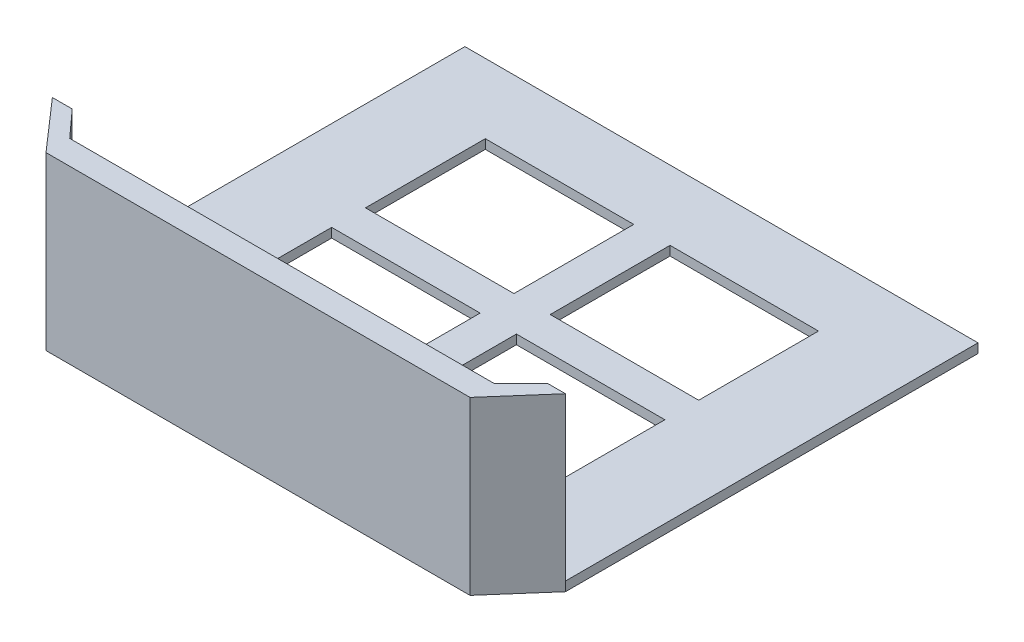
ISO-10303-21;
HEADER;
FILE_DESCRIPTION(('STEP AP214'),'2;1');
FILE_NAME('part.step','',(''),(''),'','','');
FILE_SCHEMA(('AUTOMOTIVE_DESIGN { 1 0 10303 214 1 1 1 1 }'));
ENDSEC;
DATA;
#1=APPLICATION_CONTEXT('core data for automotive mechanical design processes');
#2=APPLICATION_PROTOCOL_DEFINITION('international standard','automotive_design',2000,#1);
#3=PRODUCT_CONTEXT('',#1,'mechanical');
#4=PRODUCT('Part','Part','',(#3));
#5=PRODUCT_RELATED_PRODUCT_CATEGORY('part','',(#4));
#6=PRODUCT_DEFINITION_FORMATION('','',#4);
#7=PRODUCT_DEFINITION_CONTEXT('part definition',#1,'design');
#8=PRODUCT_DEFINITION('design','',#6,#7);
#9=PRODUCT_DEFINITION_SHAPE('','',#8);
#10=(LENGTH_UNIT() NAMED_UNIT(*) SI_UNIT(.MILLI.,.METRE.));
#11=(NAMED_UNIT(*) PLANE_ANGLE_UNIT() SI_UNIT($,.RADIAN.));
#12=(NAMED_UNIT(*) SI_UNIT($,.STERADIAN.) SOLID_ANGLE_UNIT());
#13=UNCERTAINTY_MEASURE_WITH_UNIT(LENGTH_MEASURE(1.E-05),#10,'distance_accuracy_value','');
#14=(GEOMETRIC_REPRESENTATION_CONTEXT(3) GLOBAL_UNCERTAINTY_ASSIGNED_CONTEXT((#13)) GLOBAL_UNIT_ASSIGNED_CONTEXT((#10,
#11,#12)) REPRESENTATION_CONTEXT('',''));
#15=CARTESIAN_POINT('',(0.,0.,0.));
#16=DIRECTION('',(0.,0.,1.));
#17=DIRECTION('',(1.,0.,0.));
#18=AXIS2_PLACEMENT_3D('',#15,#16,#17);
#19=CARTESIAN_POINT('',(98.6139623465558,-39.,-80.9209868313243));
#20=DIRECTION('',(-1.,0.,0.));
#21=DIRECTION('',(0.,0.,1.));
#22=AXIS2_PLACEMENT_3D('',#19,#20,#21);
#23=PLANE('',#22);
#24=DIRECTION('',(0.,-1.,0.));
#25=VECTOR('',#24,1.);
#26=CARTESIAN_POINT('',(98.6139623465558,260.630709084134,-9.99999999999998));
#27=LINE('',#26,#25);
#28=CARTESIAN_POINT('',(98.6139623465558,5.5,-9.99999999999998));
#29=VERTEX_POINT('',#28);
#30=CARTESIAN_POINT('',(98.6139623465558,0.,-9.99999999999998));
#31=VERTEX_POINT('',#30);
#32=EDGE_CURVE('E59',#29,#31,#27,.T.);
#33=ORIENTED_EDGE('',*,*,#32,.F.);
#34=DIRECTION('',(0.,0.,1.));
#35=VECTOR('',#34,1.);
#36=CARTESIAN_POINT('',(98.6139623465558,5.5,0.));
#37=LINE('',#36,#35);
#38=CARTESIAN_POINT('',(98.6139623465558,5.5,-80.9209868313243));
#39=VERTEX_POINT('',#38);
#40=EDGE_CURVE('E367',#39,#29,#37,.T.);
#41=ORIENTED_EDGE('',*,*,#40,.F.);
#42=DIRECTION('',(0.,1.,0.));
#43=VECTOR('',#42,1.);
#44=CARTESIAN_POINT('',(98.6139623465558,-39.,-80.9209868313243));
#45=LINE('',#44,#43);
#46=CARTESIAN_POINT('',(98.6139623465558,0.,-80.9209868313243));
#47=VERTEX_POINT('',#46);
#48=EDGE_CURVE('E335',#47,#39,#45,.T.);
#49=ORIENTED_EDGE('',*,*,#48,.F.);
#50=DIRECTION('',(0.,0.,1.));
#51=VECTOR('',#50,1.);
#52=CARTESIAN_POINT('',(98.6139623465558,0.,0.));
#53=LINE('',#52,#51);
#54=EDGE_CURVE('E11',#47,#31,#53,.T.);
#55=ORIENTED_EDGE('',*,*,#54,.T.);
#56=EDGE_LOOP('',(#33,#41,#49,#55));
#57=FACE_BOUND('',#56,.T.);
#58=ADVANCED_FACE('F44',(#57),#23,.T.);
#59=CARTESIAN_POINT('',(-98.6139623465558,-39.,80.9209868313243));
#60=DIRECTION('',(0.,0.,-1.));
#61=DIRECTION('',(-1.,0.,0.));
#62=AXIS2_PLACEMENT_3D('',#59,#60,#61);
#63=PLANE('',#62);
#64=DIRECTION('',(0.,-1.,0.));
#65=VECTOR('',#64,1.);
#66=CARTESIAN_POINT('',(-10.7385712790756,260.630709084134,80.9209868313243));
#67=LINE('',#66,#65);
#68=CARTESIAN_POINT('',(-10.7385712790756,5.5,80.9209868313243));
#69=VERTEX_POINT('',#68);
#70=CARTESIAN_POINT('',(-10.7385712790756,0.,80.9209868313243));
#71=VERTEX_POINT('',#70);
#72=EDGE_CURVE('E250',#69,#71,#67,.T.);
#73=ORIENTED_EDGE('',*,*,#72,.T.);
#74=DIRECTION('',(-1.,0.,0.));
#75=VECTOR('',#74,1.);
#76=CARTESIAN_POINT('',(0.,0.,80.9209868313243));
#77=LINE('',#76,#75);
#78=CARTESIAN_POINT('',(-98.6139623465558,0.,80.9209868313243));
#79=VERTEX_POINT('',#78);
#80=EDGE_CURVE('E499',#71,#79,#77,.T.);
#81=ORIENTED_EDGE('',*,*,#80,.T.);
#82=DIRECTION('',(0.,1.,0.));
#83=VECTOR('',#82,1.);
#84=CARTESIAN_POINT('',(-98.6139623465558,-39.,80.9209868313243));
#85=LINE('',#84,#83);
#86=CARTESIAN_POINT('',(-98.6139623465558,5.5,80.9209868313243));
#87=VERTEX_POINT('',#86);
#88=EDGE_CURVE('E343',#79,#87,#85,.T.);
#89=ORIENTED_EDGE('',*,*,#88,.T.);
#90=DIRECTION('',(-1.,0.,0.));
#91=VECTOR('',#90,1.);
#92=CARTESIAN_POINT('',(0.,5.5,80.9209868313243));
#93=LINE('',#92,#91);
#94=EDGE_CURVE('E361',#69,#87,#93,.T.);
#95=ORIENTED_EDGE('',*,*,#94,.F.);
#96=EDGE_LOOP('',(#73,#81,#89,#95));
#97=FACE_BOUND('',#96,.T.);
#98=ADVANCED_FACE('F509',(#97),#63,.T.);
#99=CARTESIAN_POINT('',(-98.6139623465558,-39.,-80.9209868313243));
#100=DIRECTION('',(1.,0.,0.));
#101=DIRECTION('',(0.,0.,-1.));
#102=AXIS2_PLACEMENT_3D('',#99,#100,#101);
#103=PLANE('',#102);
#104=DIRECTION('',(0.,-1.,0.));
#105=VECTOR('',#104,1.);
#106=CARTESIAN_POINT('',(-98.6139623465558,260.630709084134,10.));
#107=LINE('',#106,#105);
#108=CARTESIAN_POINT('',(-98.6139623465558,5.5,10.));
#109=VERTEX_POINT('',#108);
#110=CARTESIAN_POINT('',(-98.6139623465558,0.,10.));
#111=VERTEX_POINT('',#110);
#112=EDGE_CURVE('E308',#109,#111,#107,.T.);
#113=ORIENTED_EDGE('',*,*,#112,.F.);
#114=DIRECTION('',(0.,0.,-1.));
#115=VECTOR('',#114,1.);
#116=CARTESIAN_POINT('',(-98.6139623465558,5.5,0.));
#117=LINE('',#116,#115);
#118=EDGE_CURVE('E357',#87,#109,#117,.T.);
#119=ORIENTED_EDGE('',*,*,#118,.F.);
#120=ORIENTED_EDGE('',*,*,#88,.F.);
#121=DIRECTION('',(0.,0.,-1.));
#122=VECTOR('',#121,1.);
#123=CARTESIAN_POINT('',(-98.6139623465558,0.,0.));
#124=LINE('',#123,#122);
#125=EDGE_CURVE('E497',#79,#111,#124,.T.);
#126=ORIENTED_EDGE('',*,*,#125,.T.);
#127=EDGE_LOOP('',(#113,#119,#120,#126));
#128=FACE_BOUND('',#127,.T.);
#129=ADVANCED_FACE('F515',(#128),#103,.T.);
#130=CARTESIAN_POINT('',(-98.6139623465558,-39.,-80.9209868313243));
#131=DIRECTION('',(0.,0.,1.));
#132=DIRECTION('',(1.,0.,0.));
#133=AXIS2_PLACEMENT_3D('',#130,#131,#132);
#134=PLANE('',#133);
#135=DIRECTION('',(0.,-1.,0.));
#136=VECTOR('',#135,1.);
#137=CARTESIAN_POINT('',(-10.7385712790756,260.630709084134,-80.9209868313243));
#138=LINE('',#137,#136);
#139=CARTESIAN_POINT('',(-10.7385712790756,5.5,-80.9209868313243));
#140=VERTEX_POINT('',#139);
#141=CARTESIAN_POINT('',(-10.7385712790756,0.,-80.9209868313243));
#142=VERTEX_POINT('',#141);
#143=EDGE_CURVE('E297',#140,#142,#138,.T.);
#144=ORIENTED_EDGE('',*,*,#143,.F.);
#145=DIRECTION('',(1.,0.,0.));
#146=VECTOR('',#145,1.);
#147=CARTESIAN_POINT('',(0.,5.5,-80.9209868313243));
#148=LINE('',#147,#146);
#149=CARTESIAN_POINT('',(-98.6139623465558,5.5,-80.9209868313243));
#150=VERTEX_POINT('',#149);
#151=EDGE_CURVE('E352',#150,#140,#148,.T.);
#152=ORIENTED_EDGE('',*,*,#151,.F.);
#153=DIRECTION('',(0.,1.,0.));
#154=VECTOR('',#153,1.);
#155=CARTESIAN_POINT('',(-98.6139623465558,-39.,-80.9209868313243));
#156=LINE('',#155,#154);
#157=CARTESIAN_POINT('',(-98.6139623465558,0.,-80.9209868313243));
#158=VERTEX_POINT('',#157);
#159=EDGE_CURVE('E339',#158,#150,#156,.T.);
#160=ORIENTED_EDGE('',*,*,#159,.F.);
#161=DIRECTION('',(1.,0.,0.));
#162=VECTOR('',#161,1.);
#163=CARTESIAN_POINT('',(0.,0.,-80.9209868313243));
#164=LINE('',#163,#162);
#165=EDGE_CURVE('E493',#158,#142,#164,.T.);
#166=ORIENTED_EDGE('',*,*,#165,.T.);
#167=EDGE_LOOP('',(#144,#152,#160,#166));
#168=FACE_BOUND('',#167,.T.);
#169=ADVANCED_FACE('F581',(#168),#134,.T.);
#170=CARTESIAN_POINT('',(0.,5.5,0.));
#171=DIRECTION('',(0.,1.,0.));
#172=DIRECTION('',(0.,0.,1.));
#173=AXIS2_PLACEMENT_3D('',#170,#171,#172);
#174=PLANE('',#173);
#175=DIRECTION('',(-1.,0.,0.));
#176=VECTOR('',#175,1.);
#177=CARTESIAN_POINT('',(10.7385712790756,5.50000000000001,10.));
#178=LINE('',#177,#176);
#179=CARTESIAN_POINT('',(98.6139623465558,5.50000000000001,10.));
#180=VERTEX_POINT('',#179);
#181=CARTESIAN_POINT('',(10.7385712790756,5.50000000000001,10.));
#182=VERTEX_POINT('',#181);
#183=EDGE_CURVE('E231',#180,#182,#178,.T.);
#184=ORIENTED_EDGE('',*,*,#183,.F.);
#185=CARTESIAN_POINT('',(98.6139623465558,5.5,80.9209868313243));
#186=VERTEX_POINT('',#185);
#187=EDGE_CURVE('E366',#180,#186,#37,.T.);
#188=ORIENTED_EDGE('',*,*,#187,.T.);
#189=CARTESIAN_POINT('',(10.7385712790756,5.5,80.9209868313243));
#190=VERTEX_POINT('',#189);
#191=EDGE_CURVE('E362',#186,#190,#93,.T.);
#192=ORIENTED_EDGE('',*,*,#191,.T.);
#193=DIRECTION('',(0.,0.,1.));
#194=VECTOR('',#193,1.);
#195=CARTESIAN_POINT('',(10.7385712790756,5.50000000000001,80.9209868313244));
#196=LINE('',#195,#194);
#197=EDGE_CURVE('E235',#182,#190,#196,.T.);
#198=ORIENTED_EDGE('',*,*,#197,.F.);
#199=EDGE_LOOP('',(#184,#188,#192,#198));
#200=FACE_BOUND('',#199,.T.);
#201=DIRECTION('',(0.,0.,-1.));
#202=VECTOR('',#201,1.);
#203=CARTESIAN_POINT('',(-10.7385712790756,5.50000000000001,10.));
#204=LINE('',#203,#202);
#205=CARTESIAN_POINT('',(-10.7385712790756,5.50000000000001,10.));
#206=VERTEX_POINT('',#205);
#207=EDGE_CURVE('E255',#69,#206,#204,.T.);
#208=ORIENTED_EDGE('',*,*,#207,.F.);
#209=ORIENTED_EDGE('',*,*,#94,.T.);
#210=ORIENTED_EDGE('',*,*,#118,.T.);
#211=DIRECTION('',(-1.,0.,0.));
#212=VECTOR('',#211,1.);
#213=CARTESIAN_POINT('',(-98.6139623465558,5.50000000000001,10.));
#214=LINE('',#213,#212);
#215=EDGE_CURVE('E304',#206,#109,#214,.T.);
#216=ORIENTED_EDGE('',*,*,#215,.F.);
#217=EDGE_LOOP('',(#208,#209,#210,#216));
#218=FACE_BOUND('',#217,.T.);
#219=DIRECTION('',(1.,0.,0.));
#220=VECTOR('',#219,1.);
#221=CARTESIAN_POINT('',(-10.7385712790756,5.50000000000001,-9.99999999999998));
#222=LINE('',#221,#220);
#223=CARTESIAN_POINT('',(-98.6139623465558,5.50000000000001,-9.99999999999998));
#224=VERTEX_POINT('',#223);
#225=CARTESIAN_POINT('',(-10.7385712790756,5.50000000000001,-9.99999999999998));
#226=VERTEX_POINT('',#225);
#227=EDGE_CURVE('E299',#224,#226,#222,.T.);
#228=ORIENTED_EDGE('',*,*,#227,.F.);
#229=EDGE_CURVE('E356',#224,#150,#117,.T.);
#230=ORIENTED_EDGE('',*,*,#229,.T.);
#231=ORIENTED_EDGE('',*,*,#151,.T.);
#232=DIRECTION('',(0.,0.,-1.));
#233=VECTOR('',#232,1.);
#234=CARTESIAN_POINT('',(-10.7385712790756,5.50000000000001,-80.9209868313243));
#235=LINE('',#234,#233);
#236=EDGE_CURVE('E293',#226,#140,#235,.T.);
#237=ORIENTED_EDGE('',*,*,#236,.F.);
#238=EDGE_LOOP('',(#228,#230,#231,#237));
#239=FACE_BOUND('',#238,.T.);
#240=DIRECTION('',(-1.,0.,0.));
#241=VECTOR('',#240,1.);
#242=CARTESIAN_POINT('',(-151.846153846154,5.5,122.087912087912));
#243=LINE('',#242,#241);
#244=CARTESIAN_POINT('',(-140.09050176003,5.5,122.087912087912));
#245=VERTEX_POINT('',#244);
#246=CARTESIAN_POINT('',(-151.846153846154,5.5,122.087912087912));
#247=VERTEX_POINT('',#246);
#248=EDGE_CURVE('E376',#245,#247,#243,.T.);
#249=ORIENTED_EDGE('',*,*,#248,.F.);
#250=DIRECTION('',(-0.671286206504923,0.,-0.741198238635408));
#251=VECTOR('',#250,1.);
#252=CARTESIAN_POINT('',(-125.734949827848,5.5,137.938542867549));
#253=LINE('',#252,#251);
#254=CARTESIAN_POINT('',(-125.734949827848,5.5,137.938542867549));
#255=VERTEX_POINT('',#254);
#256=EDGE_CURVE('E410',#255,#245,#253,.T.);
#257=ORIENTED_EDGE('',*,*,#256,.F.);
#258=DIRECTION('',(-1.,0.,0.));
#259=VECTOR('',#258,1.);
#260=CARTESIAN_POINT('',(-125.734949827848,5.5,137.938542867549));
#261=LINE('',#260,#259);
#262=CARTESIAN_POINT('',(125.490601913972,5.5,137.938542867549));
#263=VERTEX_POINT('',#262);
#264=EDGE_CURVE('E406',#263,#255,#261,.T.);
#265=ORIENTED_EDGE('',*,*,#264,.F.);
#266=DIRECTION('',(-0.707106781186539,0.,0.707106781186556));
#267=VECTOR('',#266,1.);
#268=CARTESIAN_POINT('',(125.490601913972,5.5,137.938542867549));
#269=LINE('',#268,#267);
#270=CARTESIAN_POINT('',(141.341232693608,5.5,122.087912087912));
#271=VERTEX_POINT('',#270);
#272=EDGE_CURVE('E402',#271,#263,#269,.T.);
#273=ORIENTED_EDGE('',*,*,#272,.F.);
#274=DIRECTION('',(-1.,0.,0.));
#275=VECTOR('',#274,1.);
#276=CARTESIAN_POINT('',(141.341232693608,5.5,122.087912087912));
#277=LINE('',#276,#275);
#278=CARTESIAN_POINT('',(151.846153846154,5.5,122.087912087912));
#279=VERTEX_POINT('',#278);
#280=EDGE_CURVE('E370',#279,#271,#277,.T.);
#281=ORIENTED_EDGE('',*,*,#280,.F.);
#282=DIRECTION('',(0.,0.,-1.));
#283=VECTOR('',#282,1.);
#284=CARTESIAN_POINT('',(151.846153846154,5.5,122.087912087912));
#285=LINE('',#284,#283);
#286=CARTESIAN_POINT('',(151.846153846154,5.5,-122.087912087912));
#287=VERTEX_POINT('',#286);
#288=EDGE_CURVE('E444',#279,#287,#285,.T.);
#289=ORIENTED_EDGE('',*,*,#288,.T.);
#290=DIRECTION('',(-1.,0.,0.));
#291=VECTOR('',#290,1.);
#292=CARTESIAN_POINT('',(151.846153846154,5.5,-122.087912087912));
#293=LINE('',#292,#291);
#294=CARTESIAN_POINT('',(-151.846153846154,5.5,-122.087912087912));
#295=VERTEX_POINT('',#294);
#296=EDGE_CURVE('E448',#287,#295,#293,.T.);
#297=ORIENTED_EDGE('',*,*,#296,.T.);
#298=DIRECTION('',(0.,0.,1.));
#299=VECTOR('',#298,1.);
#300=CARTESIAN_POINT('',(-151.846153846154,5.5,122.087912087912));
#301=LINE('',#300,#299);
#302=EDGE_CURVE('E441',#295,#247,#301,.T.);
#303=ORIENTED_EDGE('',*,*,#302,.T.);
#304=EDGE_LOOP('',(#249,#257,#265,#273,#281,#289,#297,#303));
#305=FACE_BOUND('',#304,.T.);
#306=ORIENTED_EDGE('',*,*,#40,.T.);
#307=DIRECTION('',(1.,0.,0.));
#308=VECTOR('',#307,1.);
#309=CARTESIAN_POINT('',(10.7385712790756,5.50000000000001,-9.99999999999998));
#310=LINE('',#309,#308);
#311=CARTESIAN_POINT('',(10.7385712790756,5.50000000000001,-9.99999999999998));
#312=VERTEX_POINT('',#311);
#313=EDGE_CURVE('E283',#312,#29,#310,.T.);
#314=ORIENTED_EDGE('',*,*,#313,.F.);
#315=DIRECTION('',(0.,0.,1.));
#316=VECTOR('',#315,1.);
#317=CARTESIAN_POINT('',(10.7385712790756,5.50000000000001,-80.9209868313243));
#318=LINE('',#317,#316);
#319=CARTESIAN_POINT('',(10.7385712790756,5.50000000000001,-80.9209868313243));
#320=VERTEX_POINT('',#319);
#321=EDGE_CURVE('E288',#320,#312,#318,.T.);
#322=ORIENTED_EDGE('',*,*,#321,.F.);
#323=EDGE_CURVE('E351',#320,#39,#148,.T.);
#324=ORIENTED_EDGE('',*,*,#323,.T.);
#325=EDGE_LOOP('',(#306,#314,#322,#324));
#326=FACE_BOUND('',#325,.T.);
#327=ADVANCED_FACE('F523',(#200,#218,#239,#305,#326),#174,.T.);
#328=CARTESIAN_POINT('',(0.,0.,0.));
#329=DIRECTION('',(0.,1.,0.));
#330=DIRECTION('',(0.,0.,1.));
#331=AXIS2_PLACEMENT_3D('',#328,#329,#330);
#332=PLANE('',#331);
#333=CARTESIAN_POINT('',(98.6139623465558,0.,10.));
#334=VERTEX_POINT('',#333);
#335=CARTESIAN_POINT('',(98.6139623465558,0.,80.9209868313243));
#336=VERTEX_POINT('',#335);
#337=EDGE_CURVE('E53',#334,#336,#53,.T.);
#338=ORIENTED_EDGE('',*,*,#337,.F.);
#339=DIRECTION('',(-1.,0.,0.));
#340=VECTOR('',#339,1.);
#341=CARTESIAN_POINT('',(10.7385712790756,0.,10.));
#342=LINE('',#341,#340);
#343=CARTESIAN_POINT('',(10.7385712790756,0.,10.));
#344=VERTEX_POINT('',#343);
#345=EDGE_CURVE('E229',#334,#344,#342,.T.);
#346=ORIENTED_EDGE('',*,*,#345,.T.);
#347=DIRECTION('',(0.,0.,1.));
#348=VECTOR('',#347,1.);
#349=CARTESIAN_POINT('',(10.7385712790756,0.,80.9209868313244));
#350=LINE('',#349,#348);
#351=CARTESIAN_POINT('',(10.7385712790756,0.,80.9209868313244));
#352=VERTEX_POINT('',#351);
#353=EDGE_CURVE('E239',#344,#352,#350,.T.);
#354=ORIENTED_EDGE('',*,*,#353,.T.);
#355=EDGE_CURVE('E500',#336,#352,#77,.T.);
#356=ORIENTED_EDGE('',*,*,#355,.F.);
#357=EDGE_LOOP('',(#338,#346,#354,#356));
#358=FACE_BOUND('',#357,.T.);
#359=ORIENTED_EDGE('',*,*,#80,.F.);
#360=DIRECTION('',(0.,0.,-1.));
#361=VECTOR('',#360,1.);
#362=CARTESIAN_POINT('',(-10.7385712790756,0.,10.));
#363=LINE('',#362,#361);
#364=CARTESIAN_POINT('',(-10.7385712790756,0.,10.));
#365=VERTEX_POINT('',#364);
#366=EDGE_CURVE('E245',#71,#365,#363,.T.);
#367=ORIENTED_EDGE('',*,*,#366,.T.);
#368=DIRECTION('',(-1.,0.,0.));
#369=VECTOR('',#368,1.);
#370=CARTESIAN_POINT('',(-98.6139623465558,0.,10.));
#371=LINE('',#370,#369);
#372=EDGE_CURVE('E272',#365,#111,#371,.T.);
#373=ORIENTED_EDGE('',*,*,#372,.T.);
#374=ORIENTED_EDGE('',*,*,#125,.F.);
#375=EDGE_LOOP('',(#359,#367,#373,#374));
#376=FACE_BOUND('',#375,.T.);
#377=CARTESIAN_POINT('',(-98.6139623465558,0.,-9.99999999999998));
#378=VERTEX_POINT('',#377);
#379=EDGE_CURVE('E496',#378,#158,#124,.T.);
#380=ORIENTED_EDGE('',*,*,#379,.F.);
#381=DIRECTION('',(1.,0.,0.));
#382=VECTOR('',#381,1.);
#383=CARTESIAN_POINT('',(-10.7385712790756,0.,-9.99999999999998));
#384=LINE('',#383,#382);
#385=CARTESIAN_POINT('',(-10.7385712790756,0.,-9.99999999999998));
#386=VERTEX_POINT('',#385);
#387=EDGE_CURVE('E268',#378,#386,#384,.T.);
#388=ORIENTED_EDGE('',*,*,#387,.T.);
#389=DIRECTION('',(0.,0.,-1.));
#390=VECTOR('',#389,1.);
#391=CARTESIAN_POINT('',(-10.7385712790756,0.,-80.9209868313243));
#392=LINE('',#391,#390);
#393=EDGE_CURVE('E264',#386,#142,#392,.T.);
#394=ORIENTED_EDGE('',*,*,#393,.T.);
#395=ORIENTED_EDGE('',*,*,#165,.F.);
#396=EDGE_LOOP('',(#380,#388,#394,#395));
#397=FACE_BOUND('',#396,.T.);
#398=DIRECTION('',(0.,0.,1.));
#399=VECTOR('',#398,1.);
#400=CARTESIAN_POINT('',(-151.846153846154,0.,122.087912087912));
#401=LINE('',#400,#399);
#402=CARTESIAN_POINT('',(-151.846153846154,0.,-122.087912087912));
#403=VERTEX_POINT('',#402);
#404=CARTESIAN_POINT('',(-151.846153846154,0.,122.087912087912));
#405=VERTEX_POINT('',#404);
#406=EDGE_CURVE('E440',#403,#405,#401,.T.);
#407=ORIENTED_EDGE('',*,*,#406,.F.);
#408=DIRECTION('',(-1.,0.,0.));
#409=VECTOR('',#408,1.);
#410=CARTESIAN_POINT('',(151.846153846154,0.,-122.087912087912));
#411=LINE('',#410,#409);
#412=CARTESIAN_POINT('',(151.846153846154,0.,-122.087912087912));
#413=VERTEX_POINT('',#412);
#414=EDGE_CURVE('E445',#413,#403,#411,.T.);
#415=ORIENTED_EDGE('',*,*,#414,.F.);
#416=DIRECTION('',(0.,0.,-1.));
#417=VECTOR('',#416,1.);
#418=CARTESIAN_POINT('',(151.846153846154,0.,122.087912087912));
#419=LINE('',#418,#417);
#420=CARTESIAN_POINT('',(151.846153846154,0.,122.087912087912));
#421=VERTEX_POINT('',#420);
#422=EDGE_CURVE('E464',#421,#413,#419,.T.);
#423=ORIENTED_EDGE('',*,*,#422,.F.);
#424=DIRECTION('',(0.658504607868518,0.,-0.752576694706878));
#425=VECTOR('',#424,1.);
#426=CARTESIAN_POINT('',(151.846153846154,0.,122.087912087912));
#427=LINE('',#426,#425);
#428=CARTESIAN_POINT('',(125.490601913972,0.,152.208542867549));
#429=VERTEX_POINT('',#428);
#430=EDGE_CURVE('E461',#429,#421,#427,.T.);
#431=ORIENTED_EDGE('',*,*,#430,.F.);
#432=DIRECTION('',(1.,0.,0.));
#433=VECTOR('',#432,1.);
#434=CARTESIAN_POINT('',(125.490601913972,0.,152.208542867549));
#435=LINE('',#434,#433);
#436=CARTESIAN_POINT('',(-125.490601913972,0.,152.208542867549));
#437=VERTEX_POINT('',#436);
#438=EDGE_CURVE('E458',#437,#429,#435,.T.);
#439=ORIENTED_EDGE('',*,*,#438,.F.);
#440=DIRECTION('',(0.658504607868518,0.,0.752576694706878));
#441=VECTOR('',#440,1.);
#442=CARTESIAN_POINT('',(-125.490601913972,0.,152.208542867549));
#443=LINE('',#442,#441);
#444=EDGE_CURVE('E455',#405,#437,#443,.T.);
#445=ORIENTED_EDGE('',*,*,#444,.F.);
#446=EDGE_LOOP('',(#407,#415,#423,#431,#439,#445));
#447=FACE_BOUND('',#446,.T.);
#448=ORIENTED_EDGE('',*,*,#54,.F.);
#449=CARTESIAN_POINT('',(10.7385712790756,0.,-80.9209868313243));
#450=VERTEX_POINT('',#449);
#451=EDGE_CURVE('E492',#450,#47,#164,.T.);
#452=ORIENTED_EDGE('',*,*,#451,.F.);
#453=DIRECTION('',(0.,0.,1.));
#454=VECTOR('',#453,1.);
#455=CARTESIAN_POINT('',(10.7385712790756,0.,-80.9209868313243));
#456=LINE('',#455,#454);
#457=CARTESIAN_POINT('',(10.7385712790756,0.,-9.99999999999998));
#458=VERTEX_POINT('',#457);
#459=EDGE_CURVE('E258',#450,#458,#456,.T.);
#460=ORIENTED_EDGE('',*,*,#459,.T.);
#461=DIRECTION('',(1.,0.,0.));
#462=VECTOR('',#461,1.);
#463=CARTESIAN_POINT('',(10.7385712790756,0.,-9.99999999999998));
#464=LINE('',#463,#462);
#465=EDGE_CURVE('E251',#458,#31,#464,.T.);
#466=ORIENTED_EDGE('',*,*,#465,.T.);
#467=EDGE_LOOP('',(#448,#452,#460,#466));
#468=FACE_BOUND('',#467,.T.);
#469=ADVANCED_FACE('F247',(#358,#376,#397,#447,#468),#332,.F.);
#470=CARTESIAN_POINT('',(-151.846153846154,5.5,122.087912087912));
#471=DIRECTION('',(1.,0.,0.));
#472=DIRECTION('',(0.,0.,-1.));
#473=AXIS2_PLACEMENT_3D('',#470,#471,#472);
#474=PLANE('',#473);
#475=ORIENTED_EDGE('',*,*,#406,.T.);
#476=DIRECTION('',(0.,-1.,0.));
#477=VECTOR('',#476,1.);
#478=CARTESIAN_POINT('',(-151.846153846154,5.5,122.087912087912));
#479=LINE('',#478,#477);
#480=EDGE_CURVE('E488',#247,#405,#479,.T.);
#481=ORIENTED_EDGE('',*,*,#480,.F.);
#482=ORIENTED_EDGE('',*,*,#302,.F.);
#483=DIRECTION('',(0.,-1.,0.));
#484=VECTOR('',#483,1.);
#485=CARTESIAN_POINT('',(-151.846153846154,5.5,-122.087912087912));
#486=LINE('',#485,#484);
#487=EDGE_CURVE('E451',#295,#403,#486,.T.);
#488=ORIENTED_EDGE('',*,*,#487,.T.);
#489=EDGE_LOOP('',(#475,#481,#482,#488));
#490=FACE_BOUND('',#489,.T.);
#491=ADVANCED_FACE('F46',(#490),#474,.F.);
#492=CARTESIAN_POINT('',(-125.490601913972,5.5,152.208542867549));
#493=DIRECTION('',(0.752576694706878,0.,-0.658504607868518));
#494=DIRECTION('',(-0.658504607868518,0.,-0.752576694706878));
#495=AXIS2_PLACEMENT_3D('',#492,#493,#494);
#496=PLANE('',#495);
#497=ORIENTED_EDGE('',*,*,#444,.T.);
#498=DIRECTION('',(0.,-1.,0.));
#499=VECTOR('',#498,1.);
#500=CARTESIAN_POINT('',(-125.490601913972,5.5,152.208542867549));
#501=LINE('',#500,#499);
#502=CARTESIAN_POINT('',(-125.490601913972,101.5,152.208542867549));
#503=VERTEX_POINT('',#502);
#504=EDGE_CURVE('E484',#503,#437,#501,.T.);
#505=ORIENTED_EDGE('',*,*,#504,.F.);
#506=DIRECTION('',(0.658504607868518,0.,0.752576694706878));
#507=VECTOR('',#506,1.);
#508=CARTESIAN_POINT('',(-151.846153846154,101.5,122.087912087912));
#509=LINE('',#508,#507);
#510=CARTESIAN_POINT('',(-151.846153846154,101.5,122.087912087912));
#511=VERTEX_POINT('',#510);
#512=EDGE_CURVE('E371',#511,#503,#509,.T.);
#513=ORIENTED_EDGE('',*,*,#512,.F.);
#514=DIRECTION('',(0.,-1.,0.));
#515=VECTOR('',#514,1.);
#516=CARTESIAN_POINT('',(-151.846153846154,101.5,122.087912087912));
#517=LINE('',#516,#515);
#518=EDGE_CURVE('E398',#511,#247,#517,.T.);
#519=ORIENTED_EDGE('',*,*,#518,.T.);
#520=ORIENTED_EDGE('',*,*,#480,.T.);
#521=EDGE_LOOP('',(#497,#505,#513,#519,#520));
#522=FACE_BOUND('',#521,.T.);
#523=ADVANCED_FACE('F597',(#522),#496,.F.);
#524=CARTESIAN_POINT('',(125.490601913972,5.5,152.208542867549));
#525=DIRECTION('',(0.,0.,-1.));
#526=DIRECTION('',(-1.,0.,0.));
#527=AXIS2_PLACEMENT_3D('',#524,#525,#526);
#528=PLANE('',#527);
#529=ORIENTED_EDGE('',*,*,#438,.T.);
#530=DIRECTION('',(0.,-1.,0.));
#531=VECTOR('',#530,1.);
#532=CARTESIAN_POINT('',(125.490601913972,5.5,152.208542867549));
#533=LINE('',#532,#531);
#534=CARTESIAN_POINT('',(125.490601913972,101.5,152.208542867549));
#535=VERTEX_POINT('',#534);
#536=EDGE_CURVE('E480',#535,#429,#533,.T.);
#537=ORIENTED_EDGE('',*,*,#536,.F.);
#538=DIRECTION('',(1.,0.,0.));
#539=VECTOR('',#538,1.);
#540=CARTESIAN_POINT('',(-125.490601913972,101.5,152.208542867549));
#541=LINE('',#540,#539);
#542=EDGE_CURVE('E375',#503,#535,#541,.T.);
#543=ORIENTED_EDGE('',*,*,#542,.F.);
#544=ORIENTED_EDGE('',*,*,#504,.T.);
#545=EDGE_LOOP('',(#529,#537,#543,#544));
#546=FACE_BOUND('',#545,.T.);
#547=ADVANCED_FACE('F594',(#546),#528,.F.);
#548=CARTESIAN_POINT('',(151.846153846154,5.5,122.087912087912));
#549=DIRECTION('',(-0.752576694706878,0.,-0.658504607868518));
#550=DIRECTION('',(-0.658504607868518,0.,0.752576694706878));
#551=AXIS2_PLACEMENT_3D('',#548,#549,#550);
#552=PLANE('',#551);
#553=ORIENTED_EDGE('',*,*,#430,.T.);
#554=DIRECTION('',(0.,-1.,0.));
#555=VECTOR('',#554,1.);
#556=CARTESIAN_POINT('',(151.846153846154,5.5,122.087912087912));
#557=LINE('',#556,#555);
#558=EDGE_CURVE('E476',#279,#421,#557,.T.);
#559=ORIENTED_EDGE('',*,*,#558,.F.);
#560=DIRECTION('',(0.,-1.,0.));
#561=VECTOR('',#560,1.);
#562=CARTESIAN_POINT('',(151.846153846154,101.5,122.087912087912));
#563=LINE('',#562,#561);
#564=CARTESIAN_POINT('',(151.846153846154,101.5,122.087912087912));
#565=VERTEX_POINT('',#564);
#566=EDGE_CURVE('E436',#565,#279,#563,.T.);
#567=ORIENTED_EDGE('',*,*,#566,.F.);
#568=DIRECTION('',(0.658504607868518,0.,-0.752576694706878));
#569=VECTOR('',#568,1.);
#570=CARTESIAN_POINT('',(125.490601913972,101.5,152.208542867549));
#571=LINE('',#570,#569);
#572=EDGE_CURVE('E380',#535,#565,#571,.T.);
#573=ORIENTED_EDGE('',*,*,#572,.F.);
#574=ORIENTED_EDGE('',*,*,#536,.T.);
#575=EDGE_LOOP('',(#553,#559,#567,#573,#574));
#576=FACE_BOUND('',#575,.T.);
#577=ADVANCED_FACE('F590',(#576),#552,.F.);
#578=CARTESIAN_POINT('',(151.846153846154,5.5,122.087912087912));
#579=DIRECTION('',(-1.,0.,0.));
#580=DIRECTION('',(0.,0.,1.));
#581=AXIS2_PLACEMENT_3D('',#578,#579,#580);
#582=PLANE('',#581);
#583=ORIENTED_EDGE('',*,*,#422,.T.);
#584=DIRECTION('',(0.,-1.,0.));
#585=VECTOR('',#584,1.);
#586=CARTESIAN_POINT('',(151.846153846154,5.5,-122.087912087912));
#587=LINE('',#586,#585);
#588=EDGE_CURVE('E472',#287,#413,#587,.T.);
#589=ORIENTED_EDGE('',*,*,#588,.F.);
#590=ORIENTED_EDGE('',*,*,#288,.F.);
#591=ORIENTED_EDGE('',*,*,#558,.T.);
#592=EDGE_LOOP('',(#583,#589,#590,#591));
#593=FACE_BOUND('',#592,.T.);
#594=ADVANCED_FACE('F586',(#593),#582,.F.);
#595=CARTESIAN_POINT('',(151.846153846154,5.5,-122.087912087912));
#596=DIRECTION('',(0.,0.,1.));
#597=DIRECTION('',(1.,0.,0.));
#598=AXIS2_PLACEMENT_3D('',#595,#596,#597);
#599=PLANE('',#598);
#600=ORIENTED_EDGE('',*,*,#414,.T.);
#601=ORIENTED_EDGE('',*,*,#487,.F.);
#602=ORIENTED_EDGE('',*,*,#296,.F.);
#603=ORIENTED_EDGE('',*,*,#588,.T.);
#604=EDGE_LOOP('',(#600,#601,#602,#603));
#605=FACE_BOUND('',#604,.T.);
#606=ADVANCED_FACE('F577',(#605),#599,.F.);
#607=CARTESIAN_POINT('',(141.341232693608,101.5,122.087912087912));
#608=DIRECTION('',(0.,0.,1.));
#609=DIRECTION('',(1.,0.,0.));
#610=AXIS2_PLACEMENT_3D('',#607,#608,#609);
#611=PLANE('',#610);
#612=ORIENTED_EDGE('',*,*,#280,.T.);
#613=DIRECTION('',(0.,-1.,0.));
#614=VECTOR('',#613,1.);
#615=CARTESIAN_POINT('',(141.341232693608,101.5,122.087912087912));
#616=LINE('',#615,#614);
#617=CARTESIAN_POINT('',(141.341232693608,101.5,122.087912087912));
#618=VERTEX_POINT('',#617);
#619=EDGE_CURVE('E432',#618,#271,#616,.T.);
#620=ORIENTED_EDGE('',*,*,#619,.F.);
#621=DIRECTION('',(-1.,0.,0.));
#622=VECTOR('',#621,1.);
#623=CARTESIAN_POINT('',(141.341232693608,101.5,122.087912087912));
#624=LINE('',#623,#622);
#625=EDGE_CURVE('E383',#565,#618,#624,.T.);
#626=ORIENTED_EDGE('',*,*,#625,.F.);
#627=ORIENTED_EDGE('',*,*,#566,.T.);
#628=EDGE_LOOP('',(#612,#620,#626,#627));
#629=FACE_BOUND('',#628,.T.);
#630=ADVANCED_FACE('F573',(#629),#611,.F.);
#631=CARTESIAN_POINT('',(125.490601913972,101.5,137.938542867549));
#632=DIRECTION('',(0.707106781186556,0.,0.707106781186539));
#633=DIRECTION('',(0.707106781186539,0.,-0.707106781186556));
#634=AXIS2_PLACEMENT_3D('',#631,#632,#633);
#635=PLANE('',#634);
#636=ORIENTED_EDGE('',*,*,#272,.T.);
#637=DIRECTION('',(0.,-1.,0.));
#638=VECTOR('',#637,1.);
#639=CARTESIAN_POINT('',(125.490601913972,101.5,137.938542867549));
#640=LINE('',#639,#638);
#641=CARTESIAN_POINT('',(125.490601913972,101.5,137.938542867549));
#642=VERTEX_POINT('',#641);
#643=EDGE_CURVE('E428',#642,#263,#640,.T.);
#644=ORIENTED_EDGE('',*,*,#643,.F.);
#645=DIRECTION('',(-0.707106781186539,0.,0.707106781186556));
#646=VECTOR('',#645,1.);
#647=CARTESIAN_POINT('',(125.490601913972,101.5,137.938542867549));
#648=LINE('',#647,#646);
#649=EDGE_CURVE('E386',#618,#642,#648,.T.);
#650=ORIENTED_EDGE('',*,*,#649,.F.);
#651=ORIENTED_EDGE('',*,*,#619,.T.);
#652=EDGE_LOOP('',(#636,#644,#650,#651));
#653=FACE_BOUND('',#652,.T.);
#654=ADVANCED_FACE('F569',(#653),#635,.F.);
#655=CARTESIAN_POINT('',(-125.734949827848,101.5,137.938542867549));
#656=DIRECTION('',(0.,0.,1.));
#657=DIRECTION('',(1.,0.,0.));
#658=AXIS2_PLACEMENT_3D('',#655,#656,#657);
#659=PLANE('',#658);
#660=ORIENTED_EDGE('',*,*,#264,.T.);
#661=DIRECTION('',(0.,-1.,0.));
#662=VECTOR('',#661,1.);
#663=CARTESIAN_POINT('',(-125.734949827848,101.5,137.938542867549));
#664=LINE('',#663,#662);
#665=CARTESIAN_POINT('',(-125.734949827848,101.5,137.938542867549));
#666=VERTEX_POINT('',#665);
#667=EDGE_CURVE('E424',#666,#255,#664,.T.);
#668=ORIENTED_EDGE('',*,*,#667,.F.);
#669=DIRECTION('',(-1.,0.,0.));
#670=VECTOR('',#669,1.);
#671=CARTESIAN_POINT('',(-125.734949827848,101.5,137.938542867549));
#672=LINE('',#671,#670);
#673=EDGE_CURVE('E389',#642,#666,#672,.T.);
#674=ORIENTED_EDGE('',*,*,#673,.F.);
#675=ORIENTED_EDGE('',*,*,#643,.T.);
#676=EDGE_LOOP('',(#660,#668,#674,#675));
#677=FACE_BOUND('',#676,.T.);
#678=ADVANCED_FACE('F565',(#677),#659,.F.);
#679=CARTESIAN_POINT('',(-125.734949827848,101.5,137.938542867549));
#680=DIRECTION('',(-0.741198238635407,0.,0.671286206504922));
#681=DIRECTION('',(0.671286206504922,0.,0.741198238635408));
#682=AXIS2_PLACEMENT_3D('',#679,#680,#681);
#683=PLANE('',#682);
#684=ORIENTED_EDGE('',*,*,#256,.T.);
#685=DIRECTION('',(0.,-1.,0.));
#686=VECTOR('',#685,1.);
#687=CARTESIAN_POINT('',(-140.09050176003,101.5,122.087912087912));
#688=LINE('',#687,#686);
#689=CARTESIAN_POINT('',(-140.09050176003,101.5,122.087912087912));
#690=VERTEX_POINT('',#689);
#691=EDGE_CURVE('E420',#690,#245,#688,.T.);
#692=ORIENTED_EDGE('',*,*,#691,.F.);
#693=DIRECTION('',(-0.671286206504923,0.,-0.741198238635408));
#694=VECTOR('',#693,1.);
#695=CARTESIAN_POINT('',(-125.734949827848,101.5,137.938542867549));
#696=LINE('',#695,#694);
#697=EDGE_CURVE('E392',#666,#690,#696,.T.);
#698=ORIENTED_EDGE('',*,*,#697,.F.);
#699=ORIENTED_EDGE('',*,*,#667,.T.);
#700=EDGE_LOOP('',(#684,#692,#698,#699));
#701=FACE_BOUND('',#700,.T.);
#702=ADVANCED_FACE('F559',(#701),#683,.F.);
#703=CARTESIAN_POINT('',(-151.846153846154,101.5,122.087912087912));
#704=DIRECTION('',(0.,0.,1.));
#705=DIRECTION('',(1.,0.,0.));
#706=AXIS2_PLACEMENT_3D('',#703,#704,#705);
#707=PLANE('',#706);
#708=ORIENTED_EDGE('',*,*,#248,.T.);
#709=ORIENTED_EDGE('',*,*,#518,.F.);
#710=DIRECTION('',(-1.,0.,0.));
#711=VECTOR('',#710,1.);
#712=CARTESIAN_POINT('',(-151.846153846154,101.5,122.087912087912));
#713=LINE('',#712,#711);
#714=EDGE_CURVE('E395',#690,#511,#713,.T.);
#715=ORIENTED_EDGE('',*,*,#714,.F.);
#716=ORIENTED_EDGE('',*,*,#691,.T.);
#717=EDGE_LOOP('',(#708,#709,#715,#716));
#718=FACE_BOUND('',#717,.T.);
#719=ADVANCED_FACE('F554',(#718),#707,.F.);
#720=CARTESIAN_POINT('',(0.,101.5,0.));
#721=DIRECTION('',(0.,1.,0.));
#722=DIRECTION('',(0.,0.,1.));
#723=AXIS2_PLACEMENT_3D('',#720,#721,#722);
#724=PLANE('',#723);
#725=ORIENTED_EDGE('',*,*,#512,.T.);
#726=ORIENTED_EDGE('',*,*,#542,.T.);
#727=ORIENTED_EDGE('',*,*,#572,.T.);
#728=ORIENTED_EDGE('',*,*,#625,.T.);
#729=ORIENTED_EDGE('',*,*,#649,.T.);
#730=ORIENTED_EDGE('',*,*,#673,.T.);
#731=ORIENTED_EDGE('',*,*,#697,.T.);
#732=ORIENTED_EDGE('',*,*,#714,.T.);
#733=EDGE_LOOP('',(#725,#726,#727,#728,#729,#730,#731,#732));
#734=FACE_BOUND('',#733,.T.);
#735=ADVANCED_FACE('F548',(#734),#724,.T.);
#736=DIRECTION('',(0.,-1.,0.));
#737=VECTOR('',#736,1.);
#738=CARTESIAN_POINT('',(98.6139623465558,260.630709084134,10.));
#739=LINE('',#738,#737);
#740=EDGE_CURVE('E67',#180,#334,#739,.T.);
#741=ORIENTED_EDGE('',*,*,#740,.T.);
#742=ORIENTED_EDGE('',*,*,#337,.T.);
#743=DIRECTION('',(0.,1.,0.));
#744=VECTOR('',#743,1.);
#745=CARTESIAN_POINT('',(98.6139623465558,-39.,80.9209868313243));
#746=LINE('',#745,#744);
#747=EDGE_CURVE('E347',#336,#186,#746,.T.);
#748=ORIENTED_EDGE('',*,*,#747,.T.);
#749=ORIENTED_EDGE('',*,*,#187,.F.);
#750=EDGE_LOOP('',(#741,#742,#748,#749));
#751=FACE_BOUND('',#750,.T.);
#752=ADVANCED_FACE('F539',(#751),#23,.T.);
#753=DIRECTION('',(0.,-1.,0.));
#754=VECTOR('',#753,1.);
#755=CARTESIAN_POINT('',(10.7385712790756,260.630709084134,80.9209868313244));
#756=LINE('',#755,#754);
#757=EDGE_CURVE('E241',#190,#352,#756,.T.);
#758=ORIENTED_EDGE('',*,*,#757,.F.);
#759=ORIENTED_EDGE('',*,*,#191,.F.);
#760=ORIENTED_EDGE('',*,*,#747,.F.);
#761=ORIENTED_EDGE('',*,*,#355,.T.);
#762=EDGE_LOOP('',(#758,#759,#760,#761));
#763=FACE_BOUND('',#762,.T.);
#764=ADVANCED_FACE('F545',(#763),#63,.T.);
#765=DIRECTION('',(0.,-1.,0.));
#766=VECTOR('',#765,1.);
#767=CARTESIAN_POINT('',(-98.6139623465558,260.630709084134,-9.99999999999999));
#768=LINE('',#767,#766);
#769=EDGE_CURVE('E303',#224,#378,#768,.T.);
#770=ORIENTED_EDGE('',*,*,#769,.T.);
#771=ORIENTED_EDGE('',*,*,#379,.T.);
#772=ORIENTED_EDGE('',*,*,#159,.T.);
#773=ORIENTED_EDGE('',*,*,#229,.F.);
#774=EDGE_LOOP('',(#770,#771,#772,#773));
#775=FACE_BOUND('',#774,.T.);
#776=ADVANCED_FACE('F553',(#775),#103,.T.);
#777=DIRECTION('',(0.,-1.,0.));
#778=VECTOR('',#777,1.);
#779=CARTESIAN_POINT('',(10.7385712790756,260.630709084134,-80.9209868313243));
#780=LINE('',#779,#778);
#781=EDGE_CURVE('E292',#320,#450,#780,.T.);
#782=ORIENTED_EDGE('',*,*,#781,.T.);
#783=ORIENTED_EDGE('',*,*,#451,.T.);
#784=ORIENTED_EDGE('',*,*,#48,.T.);
#785=ORIENTED_EDGE('',*,*,#323,.F.);
#786=EDGE_LOOP('',(#782,#783,#784,#785));
#787=FACE_BOUND('',#786,.T.);
#788=ADVANCED_FACE('F534',(#787),#134,.T.);
#789=CARTESIAN_POINT('',(-10.7385712790756,260.630709084134,10.));
#790=DIRECTION('',(-1.,0.,0.));
#791=DIRECTION('',(0.,0.,1.));
#792=AXIS2_PLACEMENT_3D('',#789,#790,#791);
#793=PLANE('',#792);
#794=ORIENTED_EDGE('',*,*,#72,.F.);
#795=ORIENTED_EDGE('',*,*,#207,.T.);
#796=DIRECTION('',(0.,-1.,0.));
#797=VECTOR('',#796,1.);
#798=CARTESIAN_POINT('',(-10.7385712790756,260.630709084134,10.));
#799=LINE('',#798,#797);
#800=EDGE_CURVE('E309',#206,#365,#799,.T.);
#801=ORIENTED_EDGE('',*,*,#800,.T.);
#802=ORIENTED_EDGE('',*,*,#366,.F.);
#803=EDGE_LOOP('',(#794,#795,#801,#802));
#804=FACE_BOUND('',#803,.T.);
#805=ADVANCED_FACE('F659',(#804),#793,.T.);
#806=CARTESIAN_POINT('',(-98.6139623465558,260.630709084134,10.));
#807=DIRECTION('',(0.,0.,1.));
#808=DIRECTION('',(1.,0.,0.));
#809=AXIS2_PLACEMENT_3D('',#806,#807,#808);
#810=PLANE('',#809);
#811=ORIENTED_EDGE('',*,*,#800,.F.);
#812=ORIENTED_EDGE('',*,*,#215,.T.);
#813=ORIENTED_EDGE('',*,*,#112,.T.);
#814=ORIENTED_EDGE('',*,*,#372,.F.);
#815=EDGE_LOOP('',(#811,#812,#813,#814));
#816=FACE_BOUND('',#815,.T.);
#817=ADVANCED_FACE('F520',(#816),#810,.T.);
#818=CARTESIAN_POINT('',(-10.7385712790756,260.630709084134,-9.99999999999998));
#819=DIRECTION('',(0.,0.,-1.));
#820=DIRECTION('',(-1.,0.,0.));
#821=AXIS2_PLACEMENT_3D('',#818,#819,#820);
#822=PLANE('',#821);
#823=ORIENTED_EDGE('',*,*,#769,.F.);
#824=ORIENTED_EDGE('',*,*,#227,.T.);
#825=DIRECTION('',(0.,-1.,0.));
#826=VECTOR('',#825,1.);
#827=CARTESIAN_POINT('',(-10.7385712790756,260.630709084134,-9.99999999999998));
#828=LINE('',#827,#826);
#829=EDGE_CURVE('E298',#226,#386,#828,.T.);
#830=ORIENTED_EDGE('',*,*,#829,.T.);
#831=ORIENTED_EDGE('',*,*,#387,.F.);
#832=EDGE_LOOP('',(#823,#824,#830,#831));
#833=FACE_BOUND('',#832,.T.);
#834=ADVANCED_FACE('F649',(#833),#822,.T.);
#835=CARTESIAN_POINT('',(-10.7385712790756,260.630709084134,-80.9209868313243));
#836=DIRECTION('',(-1.,0.,0.));
#837=DIRECTION('',(0.,0.,1.));
#838=AXIS2_PLACEMENT_3D('',#835,#836,#837);
#839=PLANE('',#838);
#840=ORIENTED_EDGE('',*,*,#829,.F.);
#841=ORIENTED_EDGE('',*,*,#236,.T.);
#842=ORIENTED_EDGE('',*,*,#143,.T.);
#843=ORIENTED_EDGE('',*,*,#393,.F.);
#844=EDGE_LOOP('',(#840,#841,#842,#843));
#845=FACE_BOUND('',#844,.T.);
#846=ADVANCED_FACE('F642',(#845),#839,.T.);
#847=CARTESIAN_POINT('',(10.7385712790756,260.630709084134,-80.9209868313243));
#848=DIRECTION('',(1.,0.,0.));
#849=DIRECTION('',(0.,0.,-1.));
#850=AXIS2_PLACEMENT_3D('',#847,#848,#849);
#851=PLANE('',#850);
#852=ORIENTED_EDGE('',*,*,#781,.F.);
#853=ORIENTED_EDGE('',*,*,#321,.T.);
#854=DIRECTION('',(0.,-1.,0.));
#855=VECTOR('',#854,1.);
#856=CARTESIAN_POINT('',(10.7385712790756,260.630709084134,-9.99999999999998));
#857=LINE('',#856,#855);
#858=EDGE_CURVE('E287',#312,#458,#857,.T.);
#859=ORIENTED_EDGE('',*,*,#858,.T.);
#860=ORIENTED_EDGE('',*,*,#459,.F.);
#861=EDGE_LOOP('',(#852,#853,#859,#860));
#862=FACE_BOUND('',#861,.T.);
#863=ADVANCED_FACE('F640',(#862),#851,.T.);
#864=CARTESIAN_POINT('',(10.7385712790756,260.630709084134,-9.99999999999998));
#865=DIRECTION('',(0.,0.,-1.));
#866=DIRECTION('',(-1.,0.,0.));
#867=AXIS2_PLACEMENT_3D('',#864,#865,#866);
#868=PLANE('',#867);
#869=ORIENTED_EDGE('',*,*,#858,.F.);
#870=ORIENTED_EDGE('',*,*,#313,.T.);
#871=ORIENTED_EDGE('',*,*,#32,.T.);
#872=ORIENTED_EDGE('',*,*,#465,.F.);
#873=EDGE_LOOP('',(#869,#870,#871,#872));
#874=FACE_BOUND('',#873,.T.);
#875=ADVANCED_FACE('F638',(#874),#868,.T.);
#876=CARTESIAN_POINT('',(10.7385712790756,260.630709084134,10.));
#877=DIRECTION('',(0.,0.,1.));
#878=DIRECTION('',(1.,0.,0.));
#879=AXIS2_PLACEMENT_3D('',#876,#877,#878);
#880=PLANE('',#879);
#881=ORIENTED_EDGE('',*,*,#740,.F.);
#882=ORIENTED_EDGE('',*,*,#183,.T.);
#883=DIRECTION('',(0.,-1.,0.));
#884=VECTOR('',#883,1.);
#885=CARTESIAN_POINT('',(10.7385712790756,260.630709084134,10.));
#886=LINE('',#885,#884);
#887=EDGE_CURVE('E225',#182,#344,#886,.T.);
#888=ORIENTED_EDGE('',*,*,#887,.T.);
#889=ORIENTED_EDGE('',*,*,#345,.F.);
#890=EDGE_LOOP('',(#881,#882,#888,#889));
#891=FACE_BOUND('',#890,.T.);
#892=ADVANCED_FACE('F227',(#891),#880,.T.);
#893=CARTESIAN_POINT('',(10.7385712790756,260.630709084134,80.9209868313244));
#894=DIRECTION('',(1.,0.,0.));
#895=DIRECTION('',(0.,0.,-1.));
#896=AXIS2_PLACEMENT_3D('',#893,#894,#895);
#897=PLANE('',#896);
#898=ORIENTED_EDGE('',*,*,#887,.F.);
#899=ORIENTED_EDGE('',*,*,#197,.T.);
#900=ORIENTED_EDGE('',*,*,#757,.T.);
#901=ORIENTED_EDGE('',*,*,#353,.F.);
#902=EDGE_LOOP('',(#898,#899,#900,#901));
#903=FACE_BOUND('',#902,.T.);
#904=ADVANCED_FACE('F240',(#903),#897,.T.);
#905=CLOSED_SHELL('',(#58,#98,#129,#169,#327,#469,#491,#523,#547,#577,#594,#606,#630,#654,#678,
#702,#719,#735,#752,#764,#776,#788,#805,#817,#834,#846,#863,#875,#892,#904));
#906=MANIFOLD_SOLID_BREP('B2',#905);
#907=ADVANCED_BREP_SHAPE_REPRESENTATION('',(#18,#906),#14);
#908=SHAPE_DEFINITION_REPRESENTATION(#9,#907);
ENDSEC;
END-ISO-10303-21;
